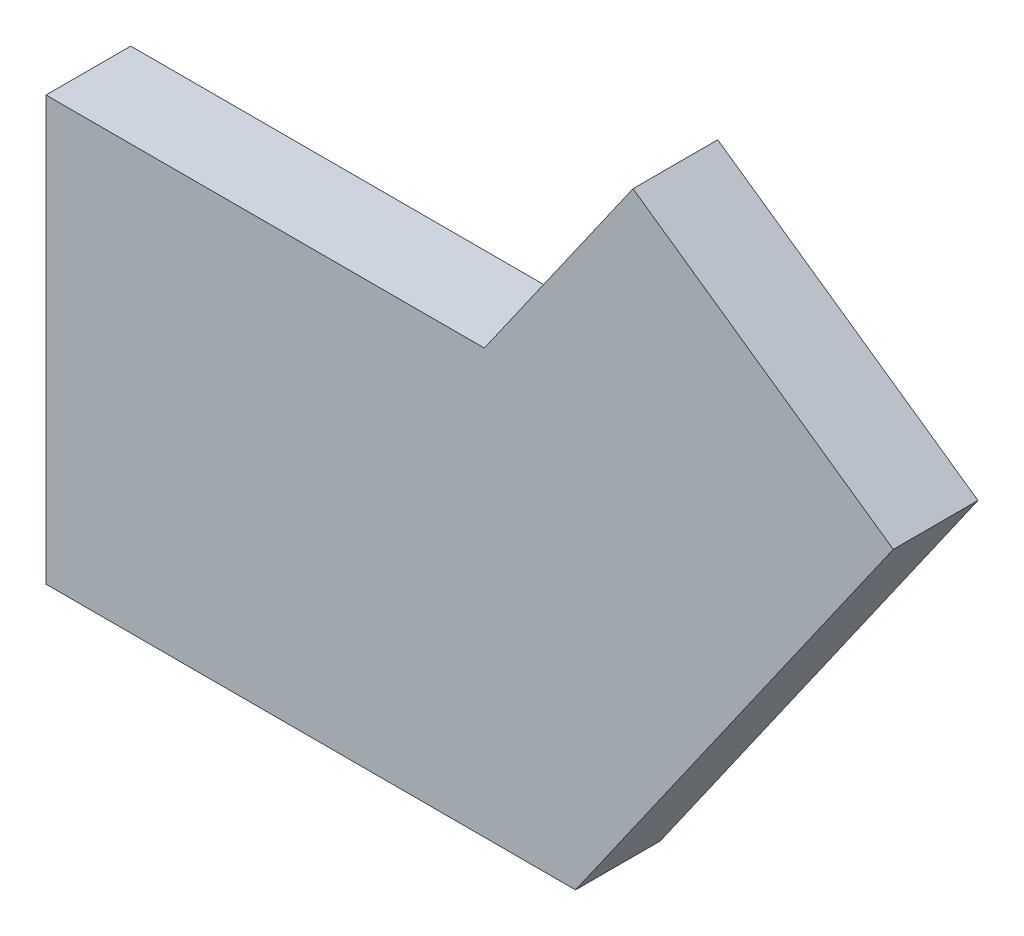
ISO-10303-21;
HEADER;
FILE_DESCRIPTION(('STEP AP214'),'2;1');
FILE_NAME('part.step','',(''),(''),'','','');
FILE_SCHEMA(('AUTOMOTIVE_DESIGN { 1 0 10303 214 1 1 1 1 }'));
ENDSEC;
DATA;
#1=APPLICATION_CONTEXT('core data for automotive mechanical design processes');
#2=APPLICATION_PROTOCOL_DEFINITION('international standard','automotive_design',2000,#1);
#3=PRODUCT_CONTEXT('',#1,'mechanical');
#4=PRODUCT('Part','Part','',(#3));
#5=PRODUCT_RELATED_PRODUCT_CATEGORY('part','',(#4));
#6=PRODUCT_DEFINITION_FORMATION('','',#4);
#7=PRODUCT_DEFINITION_CONTEXT('part definition',#1,'design');
#8=PRODUCT_DEFINITION('design','',#6,#7);
#9=PRODUCT_DEFINITION_SHAPE('','',#8);
#10=(LENGTH_UNIT() NAMED_UNIT(*) SI_UNIT(.MILLI.,.METRE.));
#11=(NAMED_UNIT(*) PLANE_ANGLE_UNIT() SI_UNIT($,.RADIAN.));
#12=(NAMED_UNIT(*) SI_UNIT($,.STERADIAN.) SOLID_ANGLE_UNIT());
#13=UNCERTAINTY_MEASURE_WITH_UNIT(LENGTH_MEASURE(1.E-05),#10,'distance_accuracy_value','');
#14=(GEOMETRIC_REPRESENTATION_CONTEXT(3) GLOBAL_UNCERTAINTY_ASSIGNED_CONTEXT((#13)) GLOBAL_UNIT_ASSIGNED_CONTEXT((#10,
#11,#12)) REPRESENTATION_CONTEXT('',''));
#15=CARTESIAN_POINT('',(0.,0.,0.));
#16=DIRECTION('',(0.,0.,1.));
#17=DIRECTION('',(1.,0.,0.));
#18=AXIS2_PLACEMENT_3D('',#15,#16,#17);
#19=CARTESIAN_POINT('',(0.,0.,20.));
#20=DIRECTION('',(-0.819152044288989,0.57357643635105,0.));
#21=DIRECTION('',(-0.57357643635105,-0.819152044288989,0.));
#22=AXIS2_PLACEMENT_3D('',#19,#20,#21);
#23=PLANE('',#22);
#24=DIRECTION('',(0.57357643635105,0.819152044288989,0.));
#25=VECTOR('',#24,1.);
#26=CARTESIAN_POINT('',(0.,0.,0.));
#27=LINE('',#26,#25);
#28=CARTESIAN_POINT('',(0.,0.,0.));
#29=VERTEX_POINT('',#28);
#30=CARTESIAN_POINT('',(75.,107.111100505658,0.));
#31=VERTEX_POINT('',#30);
#32=EDGE_CURVE('E120',#29,#31,#27,.T.);
#33=ORIENTED_EDGE('',*,*,#32,.T.);
#34=DIRECTION('',(0.,0.,-1.));
#35=VECTOR('',#34,1.);
#36=CARTESIAN_POINT('',(75.,107.111100505658,20.));
#37=LINE('',#36,#35);
#38=CARTESIAN_POINT('',(75.,107.111100505658,20.));
#39=VERTEX_POINT('',#38);
#40=EDGE_CURVE('E11',#39,#31,#37,.T.);
#41=ORIENTED_EDGE('',*,*,#40,.F.);
#42=DIRECTION('',(0.57357643635105,0.819152044288989,0.));
#43=VECTOR('',#42,1.);
#44=CARTESIAN_POINT('',(0.,0.,20.));
#45=LINE('',#44,#43);
#46=CARTESIAN_POINT('',(0.,0.,20.));
#47=VERTEX_POINT('',#46);
#48=EDGE_CURVE('E130',#47,#39,#45,.T.);
#49=ORIENTED_EDGE('',*,*,#48,.F.);
#50=DIRECTION('',(0.,0.,-1.));
#51=VECTOR('',#50,1.);
#52=CARTESIAN_POINT('',(0.,0.,20.));
#53=LINE('',#52,#51);
#54=EDGE_CURVE('E116',#47,#29,#53,.T.);
#55=ORIENTED_EDGE('',*,*,#54,.T.);
#56=EDGE_LOOP('',(#33,#41,#49,#55));
#57=FACE_BOUND('',#56,.T.);
#58=ADVANCED_FACE('F36',(#57),#23,.F.);
#59=CARTESIAN_POINT('',(75.,107.111100505658,20.));
#60=DIRECTION('',(-0.573576436351049,-0.81915204428899,0.));
#61=DIRECTION('',(0.81915204428899,-0.573576436351049,0.));
#62=AXIS2_PLACEMENT_3D('',#59,#60,#61);
#63=PLANE('',#62);
#64=DIRECTION('',(-0.81915204428899,0.573576436351049,0.));
#65=VECTOR('',#64,1.);
#66=CARTESIAN_POINT('',(75.,107.111100505658,0.));
#67=LINE('',#66,#65);
#68=CARTESIAN_POINT('',(13.5635966783258,150.129333231986,0.));
#69=VERTEX_POINT('',#68);
#70=EDGE_CURVE('E123',#31,#69,#67,.T.);
#71=ORIENTED_EDGE('',*,*,#70,.T.);
#72=DIRECTION('',(0.,0.,-1.));
#73=VECTOR('',#72,1.);
#74=CARTESIAN_POINT('',(13.5635966783258,150.129333231986,20.));
#75=LINE('',#74,#73);
#76=CARTESIAN_POINT('',(13.5635966783258,150.129333231986,20.));
#77=VERTEX_POINT('',#76);
#78=EDGE_CURVE('E44',#77,#69,#75,.T.);
#79=ORIENTED_EDGE('',*,*,#78,.F.);
#80=DIRECTION('',(-0.81915204428899,0.573576436351049,0.));
#81=VECTOR('',#80,1.);
#82=CARTESIAN_POINT('',(75.,107.111100505658,20.));
#83=LINE('',#82,#81);
#84=EDGE_CURVE('E89',#39,#77,#83,.T.);
#85=ORIENTED_EDGE('',*,*,#84,.F.);
#86=ORIENTED_EDGE('',*,*,#40,.T.);
#87=EDGE_LOOP('',(#71,#79,#85,#86));
#88=FACE_BOUND('',#87,.T.);
#89=ADVANCED_FACE('F154',(#88),#63,.F.);
#90=CARTESIAN_POINT('',(13.5635966783258,150.129333231986,20.));
#91=DIRECTION('',(0.819152044288989,-0.57357643635105,0.));
#92=DIRECTION('',(0.57357643635105,0.819152044288989,0.));
#93=AXIS2_PLACEMENT_3D('',#90,#91,#92);
#94=PLANE('',#93);
#95=DIRECTION('',(-0.57357643635105,-0.819152044288989,0.));
#96=VECTOR('',#95,1.);
#97=CARTESIAN_POINT('',(13.5635966783258,150.129333231986,0.));
#98=LINE('',#97,#96);
#99=CARTESIAN_POINT('',(-21.5373403361378,100.,0.));
#100=VERTEX_POINT('',#99);
#101=EDGE_CURVE('E125',#69,#100,#98,.T.);
#102=ORIENTED_EDGE('',*,*,#101,.T.);
#103=DIRECTION('',(0.,0.,-1.));
#104=VECTOR('',#103,1.);
#105=CARTESIAN_POINT('',(-21.5373403361378,100.,20.));
#106=LINE('',#105,#104);
#107=CARTESIAN_POINT('',(-21.5373403361378,100.,20.));
#108=VERTEX_POINT('',#107);
#109=EDGE_CURVE('E111',#108,#100,#106,.T.);
#110=ORIENTED_EDGE('',*,*,#109,.F.);
#111=DIRECTION('',(-0.57357643635105,-0.819152044288989,0.));
#112=VECTOR('',#111,1.);
#113=CARTESIAN_POINT('',(13.5635966783258,150.129333231986,20.));
#114=LINE('',#113,#112);
#115=EDGE_CURVE('E102',#77,#108,#114,.T.);
#116=ORIENTED_EDGE('',*,*,#115,.F.);
#117=ORIENTED_EDGE('',*,*,#78,.T.);
#118=EDGE_LOOP('',(#102,#110,#116,#117));
#119=FACE_BOUND('',#118,.T.);
#120=ADVANCED_FACE('F136',(#119),#94,.F.);
#121=CARTESIAN_POINT('',(-125.,100.,20.));
#122=DIRECTION('',(0.,-1.,0.));
#123=DIRECTION('',(0.,0.,-1.));
#124=AXIS2_PLACEMENT_3D('',#121,#122,#123);
#125=PLANE('',#124);
#126=DIRECTION('',(-1.,0.,0.));
#127=VECTOR('',#126,1.);
#128=CARTESIAN_POINT('',(-125.,100.,0.));
#129=LINE('',#128,#127);
#130=CARTESIAN_POINT('',(-125.,100.,0.));
#131=VERTEX_POINT('',#130);
#132=EDGE_CURVE('E110',#100,#131,#129,.T.);
#133=ORIENTED_EDGE('',*,*,#132,.T.);
#134=DIRECTION('',(0.,0.,-1.));
#135=VECTOR('',#134,1.);
#136=CARTESIAN_POINT('',(-125.,100.,20.));
#137=LINE('',#136,#135);
#138=CARTESIAN_POINT('',(-125.,100.,20.));
#139=VERTEX_POINT('',#138);
#140=EDGE_CURVE('E107',#139,#131,#137,.T.);
#141=ORIENTED_EDGE('',*,*,#140,.F.);
#142=DIRECTION('',(-1.,0.,0.));
#143=VECTOR('',#142,1.);
#144=CARTESIAN_POINT('',(-125.,100.,20.));
#145=LINE('',#144,#143);
#146=EDGE_CURVE('E96',#108,#139,#145,.T.);
#147=ORIENTED_EDGE('',*,*,#146,.F.);
#148=ORIENTED_EDGE('',*,*,#109,.T.);
#149=EDGE_LOOP('',(#133,#141,#147,#148));
#150=FACE_BOUND('',#149,.T.);
#151=ADVANCED_FACE('F108',(#150),#125,.F.);
#152=CARTESIAN_POINT('',(-125.,0.,20.));
#153=DIRECTION('',(1.,0.,0.));
#154=DIRECTION('',(0.,0.,-1.));
#155=AXIS2_PLACEMENT_3D('',#152,#153,#154);
#156=PLANE('',#155);
#157=DIRECTION('',(0.,-1.,0.));
#158=VECTOR('',#157,1.);
#159=CARTESIAN_POINT('',(-125.,0.,0.));
#160=LINE('',#159,#158);
#161=CARTESIAN_POINT('',(-125.,0.,0.));
#162=VERTEX_POINT('',#161);
#163=EDGE_CURVE('E75',#131,#162,#160,.T.);
#164=ORIENTED_EDGE('',*,*,#163,.T.);
#165=DIRECTION('',(0.,0.,-1.));
#166=VECTOR('',#165,1.);
#167=CARTESIAN_POINT('',(-125.,0.,20.));
#168=LINE('',#167,#166);
#169=CARTESIAN_POINT('',(-125.,0.,20.));
#170=VERTEX_POINT('',#169);
#171=EDGE_CURVE('E112',#170,#162,#168,.T.);
#172=ORIENTED_EDGE('',*,*,#171,.F.);
#173=DIRECTION('',(0.,-1.,0.));
#174=VECTOR('',#173,1.);
#175=CARTESIAN_POINT('',(-125.,0.,20.));
#176=LINE('',#175,#174);
#177=EDGE_CURVE('E100',#139,#170,#176,.T.);
#178=ORIENTED_EDGE('',*,*,#177,.F.);
#179=ORIENTED_EDGE('',*,*,#140,.T.);
#180=EDGE_LOOP('',(#164,#172,#178,#179));
#181=FACE_BOUND('',#180,.T.);
#182=ADVANCED_FACE('F114',(#181),#156,.F.);
#183=CARTESIAN_POINT('',(0.,0.,20.));
#184=DIRECTION('',(0.,1.,0.));
#185=DIRECTION('',(0.,0.,1.));
#186=AXIS2_PLACEMENT_3D('',#183,#184,#185);
#187=PLANE('',#186);
#188=DIRECTION('',(1.,0.,0.));
#189=VECTOR('',#188,1.);
#190=CARTESIAN_POINT('',(0.,0.,0.));
#191=LINE('',#190,#189);
#192=EDGE_CURVE('E81',#162,#29,#191,.T.);
#193=ORIENTED_EDGE('',*,*,#192,.T.);
#194=ORIENTED_EDGE('',*,*,#54,.F.);
#195=DIRECTION('',(1.,0.,0.));
#196=VECTOR('',#195,1.);
#197=CARTESIAN_POINT('',(0.,0.,20.));
#198=LINE('',#197,#196);
#199=EDGE_CURVE('E52',#170,#47,#198,.T.);
#200=ORIENTED_EDGE('',*,*,#199,.F.);
#201=ORIENTED_EDGE('',*,*,#171,.T.);
#202=EDGE_LOOP('',(#193,#194,#200,#201));
#203=FACE_BOUND('',#202,.T.);
#204=ADVANCED_FACE('F143',(#203),#187,.F.);
#205=CARTESIAN_POINT('',(0.,0.,20.));
#206=DIRECTION('',(0.,0.,1.));
#207=DIRECTION('',(1.,0.,0.));
#208=AXIS2_PLACEMENT_3D('',#205,#206,#207);
#209=PLANE('',#208);
#210=ORIENTED_EDGE('',*,*,#48,.T.);
#211=ORIENTED_EDGE('',*,*,#84,.T.);
#212=ORIENTED_EDGE('',*,*,#115,.T.);
#213=ORIENTED_EDGE('',*,*,#146,.T.);
#214=ORIENTED_EDGE('',*,*,#177,.T.);
#215=ORIENTED_EDGE('',*,*,#199,.T.);
#216=EDGE_LOOP('',(#210,#211,#212,#213,#214,#215));
#217=FACE_BOUND('',#216,.T.);
#218=ADVANCED_FACE('F98',(#217),#209,.T.);
#219=CARTESIAN_POINT('',(0.,0.,0.));
#220=DIRECTION('',(0.,0.,1.));
#221=DIRECTION('',(1.,0.,0.));
#222=AXIS2_PLACEMENT_3D('',#219,#220,#221);
#223=PLANE('',#222);
#224=ORIENTED_EDGE('',*,*,#32,.F.);
#225=ORIENTED_EDGE('',*,*,#192,.F.);
#226=ORIENTED_EDGE('',*,*,#163,.F.);
#227=ORIENTED_EDGE('',*,*,#132,.F.);
#228=ORIENTED_EDGE('',*,*,#101,.F.);
#229=ORIENTED_EDGE('',*,*,#70,.F.);
#230=EDGE_LOOP('',(#224,#225,#226,#227,#228,#229));
#231=FACE_BOUND('',#230,.T.);
#232=ADVANCED_FACE('F139',(#231),#223,.F.);
#233=CLOSED_SHELL('',(#58,#89,#120,#151,#182,#204,#218,#232));
#234=MANIFOLD_SOLID_BREP('B2',#233);
#235=ADVANCED_BREP_SHAPE_REPRESENTATION('',(#18,#234),#14);
#236=SHAPE_DEFINITION_REPRESENTATION(#9,#235);
ENDSEC;
END-ISO-10303-21;
